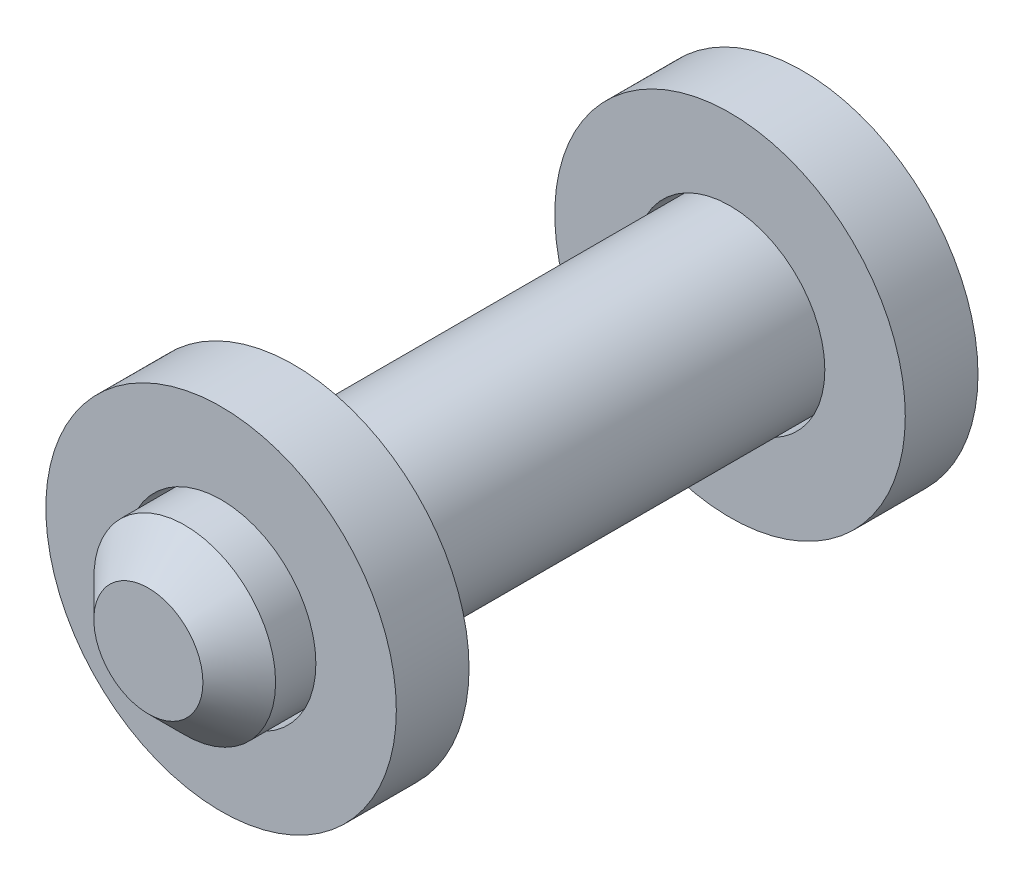
ISO-10303-21;
HEADER;
FILE_DESCRIPTION(('STEP AP214'),'2;1');
FILE_NAME('part.step','',(''),(''),'','','');
FILE_SCHEMA(('AUTOMOTIVE_DESIGN { 1 0 10303 214 1 1 1 1 }'));
ENDSEC;
DATA;
#1=APPLICATION_CONTEXT('core data for automotive mechanical design processes');
#2=APPLICATION_PROTOCOL_DEFINITION('international standard','automotive_design',2000,#1);
#3=PRODUCT_CONTEXT('',#1,'mechanical');
#4=PRODUCT('Part','Part','',(#3));
#5=PRODUCT_RELATED_PRODUCT_CATEGORY('part','',(#4));
#6=PRODUCT_DEFINITION_FORMATION('','',#4);
#7=PRODUCT_DEFINITION_CONTEXT('part definition',#1,'design');
#8=PRODUCT_DEFINITION('design','',#6,#7);
#9=PRODUCT_DEFINITION_SHAPE('','',#8);
#10=(LENGTH_UNIT() NAMED_UNIT(*) SI_UNIT(.MILLI.,.METRE.));
#11=(NAMED_UNIT(*) PLANE_ANGLE_UNIT() SI_UNIT($,.RADIAN.));
#12=(NAMED_UNIT(*) SI_UNIT($,.STERADIAN.) SOLID_ANGLE_UNIT());
#13=UNCERTAINTY_MEASURE_WITH_UNIT(LENGTH_MEASURE(1.E-05),#10,'distance_accuracy_value','');
#14=(GEOMETRIC_REPRESENTATION_CONTEXT(3) GLOBAL_UNCERTAINTY_ASSIGNED_CONTEXT((#13)) GLOBAL_UNIT_ASSIGNED_CONTEXT((#10,
#11,#12)) REPRESENTATION_CONTEXT('',''));
#15=CARTESIAN_POINT('',(0.,0.,0.));
#16=DIRECTION('',(0.,0.,1.));
#17=DIRECTION('',(1.,0.,0.));
#18=AXIS2_PLACEMENT_3D('',#15,#16,#17);
#19=CARTESIAN_POINT('',(0.,0.,-8.));
#20=DIRECTION('',(0.,0.,-1.));
#21=DIRECTION('',(1.,0.,0.));
#22=AXIS2_PLACEMENT_3D('',#19,#20,#21);
#23=PLANE('',#22);
#24=CARTESIAN_POINT('',(0.,0.,-8.));
#25=DIRECTION('',(0.,0.,1.));
#26=DIRECTION('',(1.,0.,0.));
#27=AXIS2_PLACEMENT_3D('',#24,#25,#26);
#28=CIRCLE('',#27,4.82079346270476);
#29=CARTESIAN_POINT('',(4.82079346270476,0.,-8.));
#30=VERTEX_POINT('',#29);
#31=EDGE_CURVE('E11',#30,#30,#28,.T.);
#32=ORIENTED_EDGE('',*,*,#31,.F.);
#33=EDGE_LOOP('',(#32));
#34=FACE_BOUND('',#33,.T.);
#35=CARTESIAN_POINT('',(0.,0.,-8.));
#36=DIRECTION('',(0.,0.,1.));
#37=DIRECTION('',(1.,0.,0.));
#38=AXIS2_PLACEMENT_3D('',#35,#36,#37);
#39=CIRCLE('',#38,2.60774436707483);
#40=CARTESIAN_POINT('',(2.60774436707483,0.,-8.));
#41=VERTEX_POINT('',#40);
#42=EDGE_CURVE('E57',#41,#41,#39,.T.);
#43=ORIENTED_EDGE('',*,*,#42,.T.);
#44=EDGE_LOOP('',(#43));
#45=FACE_BOUND('',#44,.T.);
#46=ADVANCED_FACE('F46',(#34,#45),#23,.T.);
#47=CARTESIAN_POINT('',(0.,0.,-6.));
#48=DIRECTION('',(0.,0.,-1.));
#49=DIRECTION('',(1.,0.,0.));
#50=AXIS2_PLACEMENT_3D('',#47,#48,#49);
#51=PLANE('',#50);
#52=CARTESIAN_POINT('',(0.,0.,-6.));
#53=DIRECTION('',(0.,0.,1.));
#54=DIRECTION('',(1.,0.,0.));
#55=AXIS2_PLACEMENT_3D('',#52,#53,#54);
#56=CIRCLE('',#55,4.82079346270476);
#57=CARTESIAN_POINT('',(4.82079346270476,0.,-6.));
#58=VERTEX_POINT('',#57);
#59=EDGE_CURVE('E50',#58,#58,#56,.T.);
#60=ORIENTED_EDGE('',*,*,#59,.T.);
#61=EDGE_LOOP('',(#60));
#62=FACE_BOUND('',#61,.T.);
#63=CARTESIAN_POINT('',(0.,0.,-6.));
#64=DIRECTION('',(0.,0.,1.));
#65=DIRECTION('',(1.,0.,0.));
#66=AXIS2_PLACEMENT_3D('',#63,#64,#65);
#67=CIRCLE('',#66,2.60774436707483);
#68=CARTESIAN_POINT('',(2.60774436707483,0.,-6.));
#69=VERTEX_POINT('',#68);
#70=EDGE_CURVE('E59',#69,#69,#67,.T.);
#71=ORIENTED_EDGE('',*,*,#70,.F.);
#72=EDGE_LOOP('',(#71));
#73=FACE_BOUND('',#72,.T.);
#74=ADVANCED_FACE('F72',(#62,#73),#51,.F.);
#75=CARTESIAN_POINT('',(0.,0.,-8.));
#76=DIRECTION('',(0.,0.,1.));
#77=DIRECTION('',(-1.,0.,0.));
#78=AXIS2_PLACEMENT_3D('',#75,#76,#77);
#79=CYLINDRICAL_SURFACE('',#78,4.82079346270476);
#80=ORIENTED_EDGE('',*,*,#31,.T.);
#81=EDGE_LOOP('',(#80));
#82=FACE_BOUND('',#81,.T.);
#83=ORIENTED_EDGE('',*,*,#59,.F.);
#84=EDGE_LOOP('',(#83));
#85=FACE_BOUND('',#84,.T.);
#86=ADVANCED_FACE('F48',(#82,#85),#79,.T.);
#87=CARTESIAN_POINT('',(0.,0.,-8.));
#88=DIRECTION('',(0.,0.,1.));
#89=DIRECTION('',(-1.,0.,0.));
#90=AXIS2_PLACEMENT_3D('',#87,#88,#89);
#91=CYLINDRICAL_SURFACE('',#90,2.60774436707483);
#92=ORIENTED_EDGE('',*,*,#42,.F.);
#93=EDGE_LOOP('',(#92));
#94=FACE_BOUND('',#93,.T.);
#95=ORIENTED_EDGE('',*,*,#70,.T.);
#96=EDGE_LOOP('',(#95));
#97=FACE_BOUND('',#96,.T.);
#98=ADVANCED_FACE('F66',(#94,#97),#91,.F.);
#99=CLOSED_SHELL('',(#46,#74,#86,#98));
#100=MANIFOLD_SOLID_BREP('B2',#99);
#101=CARTESIAN_POINT('',(0.,0.,8.));
#102=DIRECTION('',(0.,0.,1.));
#103=DIRECTION('',(1.,0.,0.));
#104=AXIS2_PLACEMENT_3D('',#101,#102,#103);
#105=PLANE('',#104);
#106=CARTESIAN_POINT('',(0.,0.,8.));
#107=DIRECTION('',(0.,0.,1.));
#108=DIRECTION('',(1.,0.,0.));
#109=AXIS2_PLACEMENT_3D('',#106,#107,#108);
#110=CIRCLE('',#109,4.82079346270476);
#111=CARTESIAN_POINT('',(4.82079346270476,0.,8.));
#112=VERTEX_POINT('',#111);
#113=EDGE_CURVE('E45',#112,#112,#110,.T.);
#114=ORIENTED_EDGE('',*,*,#113,.T.);
#115=EDGE_LOOP('',(#114));
#116=FACE_BOUND('',#115,.T.);
#117=CARTESIAN_POINT('',(0.,0.,8.));
#118=DIRECTION('',(0.,0.,1.));
#119=DIRECTION('',(1.,0.,0.));
#120=AXIS2_PLACEMENT_3D('',#117,#118,#119);
#121=CIRCLE('',#120,2.60774436707483);
#122=CARTESIAN_POINT('',(2.60774436707483,0.,8.));
#123=VERTEX_POINT('',#122);
#124=EDGE_CURVE('E142',#123,#123,#121,.T.);
#125=ORIENTED_EDGE('',*,*,#124,.F.);
#126=EDGE_LOOP('',(#125));
#127=FACE_BOUND('',#126,.T.);
#128=ADVANCED_FACE('F131',(#116,#127),#105,.T.);
#129=CARTESIAN_POINT('',(0.,0.,6.));
#130=DIRECTION('',(0.,0.,1.));
#131=DIRECTION('',(1.,0.,0.));
#132=AXIS2_PLACEMENT_3D('',#129,#130,#131);
#133=PLANE('',#132);
#134=CARTESIAN_POINT('',(0.,0.,6.));
#135=DIRECTION('',(0.,0.,1.));
#136=DIRECTION('',(1.,0.,0.));
#137=AXIS2_PLACEMENT_3D('',#134,#135,#136);
#138=CIRCLE('',#137,4.82079346270476);
#139=CARTESIAN_POINT('',(4.82079346270476,0.,6.));
#140=VERTEX_POINT('',#139);
#141=EDGE_CURVE('E135',#140,#140,#138,.T.);
#142=ORIENTED_EDGE('',*,*,#141,.F.);
#143=EDGE_LOOP('',(#142));
#144=FACE_BOUND('',#143,.T.);
#145=CARTESIAN_POINT('',(0.,0.,6.));
#146=DIRECTION('',(0.,0.,1.));
#147=DIRECTION('',(1.,0.,0.));
#148=AXIS2_PLACEMENT_3D('',#145,#146,#147);
#149=CIRCLE('',#148,2.60774436707483);
#150=CARTESIAN_POINT('',(2.60774436707483,0.,6.));
#151=VERTEX_POINT('',#150);
#152=EDGE_CURVE('E144',#151,#151,#149,.T.);
#153=ORIENTED_EDGE('',*,*,#152,.T.);
#154=EDGE_LOOP('',(#153));
#155=FACE_BOUND('',#154,.T.);
#156=ADVANCED_FACE('F154',(#144,#155),#133,.F.);
#157=CARTESIAN_POINT('',(0.,0.,8.));
#158=DIRECTION('',(0.,0.,-1.));
#159=DIRECTION('',(-1.,0.,0.));
#160=AXIS2_PLACEMENT_3D('',#157,#158,#159);
#161=CYLINDRICAL_SURFACE('',#160,4.82079346270476);
#162=ORIENTED_EDGE('',*,*,#113,.F.);
#163=EDGE_LOOP('',(#162));
#164=FACE_BOUND('',#163,.T.);
#165=ORIENTED_EDGE('',*,*,#141,.T.);
#166=EDGE_LOOP('',(#165));
#167=FACE_BOUND('',#166,.T.);
#168=ADVANCED_FACE('F133',(#164,#167),#161,.T.);
#169=CARTESIAN_POINT('',(0.,0.,8.));
#170=DIRECTION('',(0.,0.,-1.));
#171=DIRECTION('',(-1.,0.,0.));
#172=AXIS2_PLACEMENT_3D('',#169,#170,#171);
#173=CYLINDRICAL_SURFACE('',#172,2.60774436707483);
#174=ORIENTED_EDGE('',*,*,#124,.T.);
#175=EDGE_LOOP('',(#174));
#176=FACE_BOUND('',#175,.T.);
#177=ORIENTED_EDGE('',*,*,#152,.F.);
#178=EDGE_LOOP('',(#177));
#179=FACE_BOUND('',#178,.T.);
#180=ADVANCED_FACE('F150',(#176,#179),#173,.F.);
#181=CLOSED_SHELL('',(#128,#156,#168,#180));
#182=MANIFOLD_SOLID_BREP('B6',#181);
#183=CARTESIAN_POINT('',(0.,0.,10.));
#184=DIRECTION('',(0.,0.,-1.));
#185=DIRECTION('',(-1.,0.,0.));
#186=AXIS2_PLACEMENT_3D('',#183,#184,#185);
#187=CYLINDRICAL_SURFACE('',#186,2.5);
#188=CARTESIAN_POINT('',(0.,0.,-9.));
#189=DIRECTION('',(0.,0.,1.));
#190=DIRECTION('',(1.,0.,0.));
#191=AXIS2_PLACEMENT_3D('',#188,#189,#190);
#192=CIRCLE('',#191,2.5);
#193=CARTESIAN_POINT('',(2.5,0.,-9.));
#194=VERTEX_POINT('',#193);
#195=EDGE_CURVE('E196',#194,#194,#192,.T.);
#196=ORIENTED_EDGE('',*,*,#195,.T.);
#197=EDGE_LOOP('',(#196));
#198=FACE_BOUND('',#197,.T.);
#199=CARTESIAN_POINT('',(0.,0.,9.));
#200=DIRECTION('',(0.,0.,1.));
#201=DIRECTION('',(1.,0.,0.));
#202=AXIS2_PLACEMENT_3D('',#199,#200,#201);
#203=CIRCLE('',#202,2.5);
#204=CARTESIAN_POINT('',(2.5,0.,9.));
#205=VERTEX_POINT('',#204);
#206=EDGE_CURVE('E200',#205,#205,#203,.F.);
#207=ORIENTED_EDGE('',*,*,#206,.T.);
#208=EDGE_LOOP('',(#207));
#209=FACE_BOUND('',#208,.T.);
#210=ADVANCED_FACE('F185',(#198,#209),#187,.T.);
#211=CARTESIAN_POINT('',(0.,0.,10.));
#212=DIRECTION('',(0.,0.,1.));
#213=DIRECTION('',(1.,0.,0.));
#214=AXIS2_PLACEMENT_3D('',#211,#212,#213);
#215=PLANE('',#214);
#216=CARTESIAN_POINT('',(0.,0.,10.));
#217=DIRECTION('',(0.,0.,1.));
#218=DIRECTION('',(1.,0.,0.));
#219=AXIS2_PLACEMENT_3D('',#216,#217,#218);
#220=CIRCLE('',#219,1.5);
#221=CARTESIAN_POINT('',(1.5,0.,10.));
#222=VERTEX_POINT('',#221);
#223=EDGE_CURVE('E130',#222,#222,#220,.T.);
#224=ORIENTED_EDGE('',*,*,#223,.T.);
#225=EDGE_LOOP('',(#224));
#226=FACE_BOUND('',#225,.T.);
#227=ADVANCED_FACE('F216',(#226),#215,.T.);
#228=CARTESIAN_POINT('',(0.,0.,-10.));
#229=DIRECTION('',(0.,0.,1.));
#230=DIRECTION('',(1.,0.,0.));
#231=AXIS2_PLACEMENT_3D('',#228,#229,#230);
#232=PLANE('',#231);
#233=CARTESIAN_POINT('',(0.,0.,-10.));
#234=DIRECTION('',(0.,0.,1.));
#235=DIRECTION('',(1.,0.,0.));
#236=AXIS2_PLACEMENT_3D('',#233,#234,#235);
#237=CIRCLE('',#236,1.5);
#238=CARTESIAN_POINT('',(1.5,0.,-10.));
#239=VERTEX_POINT('',#238);
#240=EDGE_CURVE('E192',#239,#239,#237,.F.);
#241=ORIENTED_EDGE('',*,*,#240,.T.);
#242=EDGE_LOOP('',(#241));
#243=FACE_BOUND('',#242,.T.);
#244=ADVANCED_FACE('F213',(#243),#232,.F.);
#245=CARTESIAN_POINT('',(0.,0.,-9.));
#246=DIRECTION('',(0.,0.,1.));
#247=DIRECTION('',(1.,0.,0.));
#248=AXIS2_PLACEMENT_3D('',#245,#246,#247);
#249=CONICAL_SURFACE('',#248,2.5,0.78539816339745);
#250=ORIENTED_EDGE('',*,*,#240,.F.);
#251=EDGE_LOOP('',(#250));
#252=FACE_BOUND('',#251,.T.);
#253=ORIENTED_EDGE('',*,*,#195,.F.);
#254=EDGE_LOOP('',(#253));
#255=FACE_BOUND('',#254,.T.);
#256=ADVANCED_FACE('F209',(#252,#255),#249,.T.);
#257=CARTESIAN_POINT('',(0.,0.,10.));
#258=DIRECTION('',(0.,0.,-1.));
#259=DIRECTION('',(-1.,0.,0.));
#260=AXIS2_PLACEMENT_3D('',#257,#258,#259);
#261=CONICAL_SURFACE('',#260,1.5,0.785398163397445);
#262=ORIENTED_EDGE('',*,*,#206,.F.);
#263=EDGE_LOOP('',(#262));
#264=FACE_BOUND('',#263,.T.);
#265=ORIENTED_EDGE('',*,*,#223,.F.);
#266=EDGE_LOOP('',(#265));
#267=FACE_BOUND('',#266,.T.);
#268=ADVANCED_FACE('F187',(#264,#267),#261,.T.);
#269=CLOSED_SHELL('',(#210,#227,#244,#256,#268));
#270=MANIFOLD_SOLID_BREP('B40',#269);
#271=ADVANCED_BREP_SHAPE_REPRESENTATION('',(#18,#100,#182,#270),#14);
#272=SHAPE_DEFINITION_REPRESENTATION(#9,#271);
ENDSEC;
END-ISO-10303-21;
